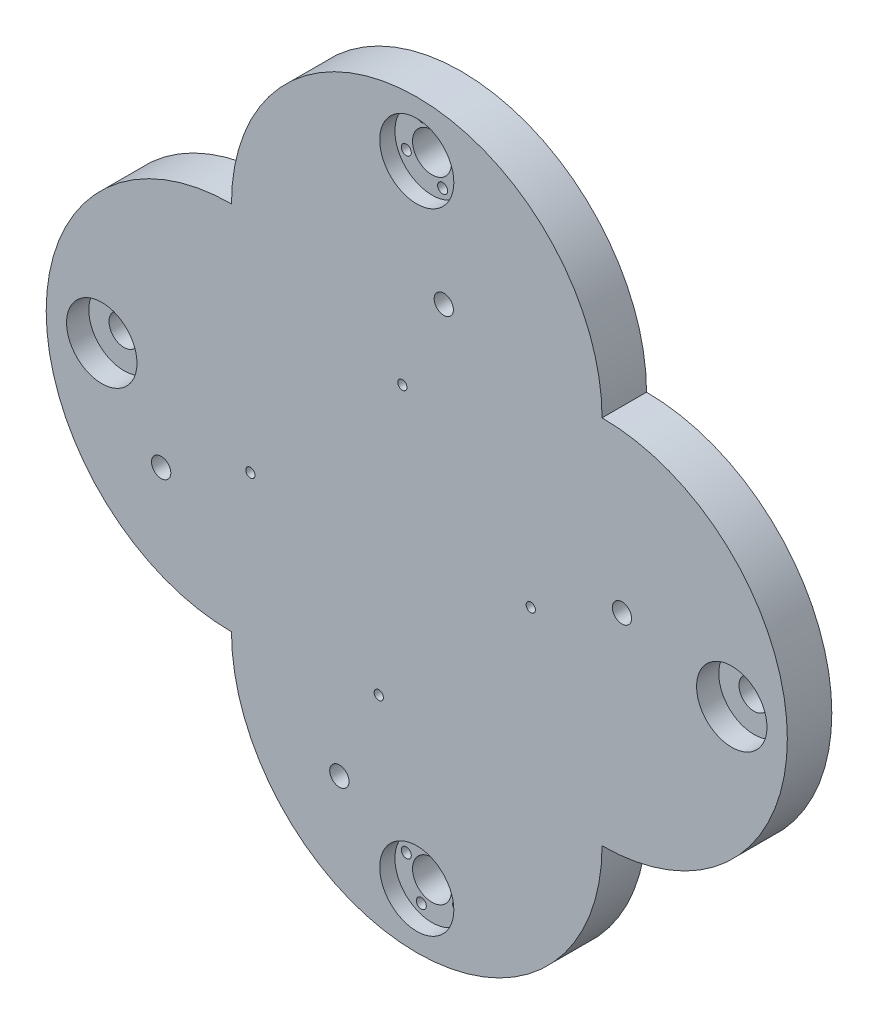
ISO-10303-21;
HEADER;
FILE_DESCRIPTION(('STEP AP214'),'2;1');
FILE_NAME('part.step','',(''),(''),'','','');
FILE_SCHEMA(('AUTOMOTIVE_DESIGN { 1 0 10303 214 1 1 1 1 }'));
ENDSEC;
DATA;
#1=APPLICATION_CONTEXT('core data for automotive mechanical design processes');
#2=APPLICATION_PROTOCOL_DEFINITION('international standard','automotive_design',2000,#1);
#3=PRODUCT_CONTEXT('',#1,'mechanical');
#4=PRODUCT('Part','Part','',(#3));
#5=PRODUCT_RELATED_PRODUCT_CATEGORY('part','',(#4));
#6=PRODUCT_DEFINITION_FORMATION('','',#4);
#7=PRODUCT_DEFINITION_CONTEXT('part definition',#1,'design');
#8=PRODUCT_DEFINITION('design','',#6,#7);
#9=PRODUCT_DEFINITION_SHAPE('','',#8);
#10=(LENGTH_UNIT() NAMED_UNIT(*) SI_UNIT(.MILLI.,.METRE.));
#11=(NAMED_UNIT(*) PLANE_ANGLE_UNIT() SI_UNIT($,.RADIAN.));
#12=(NAMED_UNIT(*) SI_UNIT($,.STERADIAN.) SOLID_ANGLE_UNIT());
#13=UNCERTAINTY_MEASURE_WITH_UNIT(LENGTH_MEASURE(1.E-05),#10,'distance_accuracy_value','');
#14=(GEOMETRIC_REPRESENTATION_CONTEXT(3) GLOBAL_UNCERTAINTY_ASSIGNED_CONTEXT((#13)) GLOBAL_UNIT_ASSIGNED_CONTEXT((#10,
#11,#12)) REPRESENTATION_CONTEXT('',''));
#15=CARTESIAN_POINT('',(0.,0.,0.));
#16=DIRECTION('',(0.,0.,1.));
#17=DIRECTION('',(1.,0.,0.));
#18=AXIS2_PLACEMENT_3D('',#15,#16,#17);
#19=CARTESIAN_POINT('',(60.9927797833935,9.56678700361011,-38.));
#20=DIRECTION('',(0.,0.,1.));
#21=DIRECTION('',(1.,0.,0.));
#22=AXIS2_PLACEMENT_3D('',#19,#20,#21);
#23=CYLINDRICAL_SURFACE('',#22,9.5);
#24=CARTESIAN_POINT('',(60.9927797833935,9.56678700361011,12.));
#25=DIRECTION('',(0.,0.,1.));
#26=DIRECTION('',(1.,0.,0.));
#27=AXIS2_PLACEMENT_3D('',#24,#25,#26);
#28=CIRCLE('',#27,9.5);
#29=CARTESIAN_POINT('',(70.4927797833935,9.56678700361011,12.));
#30=VERTEX_POINT('',#29);
#31=EDGE_CURVE('E298',#30,#30,#28,.T.);
#32=ORIENTED_EDGE('',*,*,#31,.T.);
#33=EDGE_LOOP('',(#32));
#34=FACE_BOUND('',#33,.T.);
#35=CARTESIAN_POINT('',(60.9927797833935,9.56678700361011,6.));
#36=DIRECTION('',(0.,0.,-1.));
#37=DIRECTION('',(-1.,0.,0.));
#38=AXIS2_PLACEMENT_3D('',#35,#36,#37);
#39=CIRCLE('',#38,9.5);
#40=CARTESIAN_POINT('',(51.4927797833935,9.56678700361011,6.));
#41=VERTEX_POINT('',#40);
#42=EDGE_CURVE('E11',#41,#41,#39,.F.);
#43=ORIENTED_EDGE('',*,*,#42,.F.);
#44=EDGE_LOOP('',(#43));
#45=FACE_BOUND('',#44,.T.);
#46=ADVANCED_FACE('F39',(#34,#45),#23,.F.);
#47=CARTESIAN_POINT('',(-109.007220216607,9.56678700361013,-38.));
#48=DIRECTION('',(0.,0.,1.));
#49=DIRECTION('',(1.,0.,0.));
#50=AXIS2_PLACEMENT_3D('',#47,#48,#49);
#51=CYLINDRICAL_SURFACE('',#50,9.5);
#52=CARTESIAN_POINT('',(-109.007220216607,9.56678700361013,12.));
#53=DIRECTION('',(0.,0.,1.));
#54=DIRECTION('',(1.,0.,0.));
#55=AXIS2_PLACEMENT_3D('',#52,#53,#54);
#56=CIRCLE('',#55,9.5);
#57=CARTESIAN_POINT('',(-99.5072202166065,9.56678700361013,12.));
#58=VERTEX_POINT('',#57);
#59=EDGE_CURVE('E300',#58,#58,#56,.T.);
#60=ORIENTED_EDGE('',*,*,#59,.T.);
#61=EDGE_LOOP('',(#60));
#62=FACE_BOUND('',#61,.T.);
#63=CARTESIAN_POINT('',(-109.007220216607,9.56678700361013,6.));
#64=DIRECTION('',(0.,0.,-1.));
#65=DIRECTION('',(-1.,0.,0.));
#66=AXIS2_PLACEMENT_3D('',#63,#64,#65);
#67=CIRCLE('',#66,9.5);
#68=CARTESIAN_POINT('',(-118.507220216607,9.56678700361013,6.));
#69=VERTEX_POINT('',#68);
#70=EDGE_CURVE('E48',#69,#69,#67,.F.);
#71=ORIENTED_EDGE('',*,*,#70,.F.);
#72=EDGE_LOOP('',(#71));
#73=FACE_BOUND('',#72,.T.);
#74=ADVANCED_FACE('F134',(#62,#73),#51,.F.);
#75=CARTESIAN_POINT('',(0.,0.,0.));
#76=DIRECTION('',(0.,0.,1.));
#77=DIRECTION('',(1.,0.,0.));
#78=AXIS2_PLACEMENT_3D('',#75,#76,#77);
#79=PLANE('',#78);
#80=CARTESIAN_POINT('',(-16.7171078360063,64.7627365231504,0.));
#81=DIRECTION('',(0.,0.,1.));
#82=DIRECTION('',(1.,0.,0.));
#83=AXIS2_PLACEMENT_3D('',#80,#81,#82);
#84=CIRCLE('',#83,2.59999999999999);
#85=CARTESIAN_POINT('',(-14.1171078360064,64.7627365231504,0.));
#86=VERTEX_POINT('',#85);
#87=EDGE_CURVE('E287',#86,#86,#84,.T.);
#88=ORIENTED_EDGE('',*,*,#87,.T.);
#89=EDGE_LOOP('',(#88));
#90=FACE_BOUND('',#89,.T.);
#91=CARTESIAN_POINT('',(31.3661532846789,16.6794754024652,0.));
#92=DIRECTION('',(0.,0.,1.));
#93=DIRECTION('',(1.,0.,0.));
#94=AXIS2_PLACEMENT_3D('',#91,#92,#93);
#95=CIRCLE('',#94,2.6);
#96=CARTESIAN_POINT('',(33.9661532846789,16.6794754024652,0.));
#97=VERTEX_POINT('',#96);
#98=EDGE_CURVE('E292',#97,#97,#95,.T.);
#99=ORIENTED_EDGE('',*,*,#98,.T.);
#100=EDGE_LOOP('',(#99));
#101=FACE_BOUND('',#100,.T.);
#102=CARTESIAN_POINT('',(-92.980015992399,-11.5001716332424,0.));
#103=DIRECTION('',(0.,0.,1.));
#104=DIRECTION('',(1.,0.,0.));
#105=AXIS2_PLACEMENT_3D('',#102,#103,#104);
#106=CIRCLE('',#105,2.6);
#107=CARTESIAN_POINT('',(-90.3800159923991,-11.5001716332424,0.));
#108=VERTEX_POINT('',#107);
#109=EDGE_CURVE('E475',#108,#108,#106,.T.);
#110=ORIENTED_EDGE('',*,*,#109,.T.);
#111=EDGE_LOOP('',(#110));
#112=FACE_BOUND('',#111,.T.);
#113=CARTESIAN_POINT('',(-44.8967548717138,-59.5834327539276,0.));
#114=DIRECTION('',(0.,0.,1.));
#115=DIRECTION('',(1.,0.,0.));
#116=AXIS2_PLACEMENT_3D('',#113,#114,#115);
#117=CIRCLE('',#116,2.6);
#118=CARTESIAN_POINT('',(-42.2967548717138,-59.5834327539276,0.));
#119=VERTEX_POINT('',#118);
#120=EDGE_CURVE('E478',#119,#119,#117,.T.);
#121=ORIENTED_EDGE('',*,*,#120,.T.);
#122=EDGE_LOOP('',(#121));
#123=FACE_BOUND('',#122,.T.);
#124=CARTESIAN_POINT('',(-26.8800877770809,-82.3611731564928,0.));
#125=DIRECTION('',(0.,0.,1.));
#126=DIRECTION('',(1.,0.,0.));
#127=AXIS2_PLACEMENT_3D('',#124,#125,#126);
#128=CIRCLE('',#127,1.35);
#129=CARTESIAN_POINT('',(-25.5300877770809,-82.3611731564928,0.));
#130=VERTEX_POINT('',#129);
#131=EDGE_CURVE('E338',#130,#130,#128,.F.);
#132=ORIENTED_EDGE('',*,*,#131,.F.);
#133=EDGE_LOOP('',(#132));
#134=FACE_BOUND('',#133,.T.);
#135=CARTESIAN_POINT('',(-21.1343526561322,87.6388268435071,0.));
#136=DIRECTION('',(0.,0.,1.));
#137=DIRECTION('',(1.,0.,0.));
#138=AXIS2_PLACEMENT_3D('',#135,#136,#137);
#139=CIRCLE('',#138,1.35000000000001);
#140=CARTESIAN_POINT('',(-19.7843526561322,87.6388268435071,0.));
#141=VERTEX_POINT('',#140);
#142=EDGE_CURVE('E346',#141,#141,#139,.T.);
#143=ORIENTED_EDGE('',*,*,#142,.T.);
#144=EDGE_LOOP('',(#143));
#145=FACE_BOUND('',#144,.T.);
#146=CARTESIAN_POINT('',(-24.0072202166065,94.5667870036101,0.));
#147=DIRECTION('',(0.,0.,1.));
#148=DIRECTION('',(1.,0.,0.));
#149=AXIS2_PLACEMENT_3D('',#146,#147,#148);
#150=CIRCLE('',#149,5.25);
#151=CARTESIAN_POINT('',(-18.7572202166065,94.5667870036101,0.));
#152=VERTEX_POINT('',#151);
#153=EDGE_CURVE('E342',#152,#152,#150,.T.);
#154=ORIENTED_EDGE('',*,*,#153,.T.);
#155=EDGE_LOOP('',(#154));
#156=FACE_BOUND('',#155,.T.);
#157=CARTESIAN_POINT('',(-24.0072202166065,-40.4332129963899,0.));
#158=DIRECTION('',(0.,0.,1.));
#159=DIRECTION('',(1.,0.,0.));
#160=AXIS2_PLACEMENT_3D('',#157,#158,#159);
#161=CIRCLE('',#160,50.);
#162=CARTESIAN_POINT('',(-74.0072202166065,-40.4332129963899,0.));
#163=VERTEX_POINT('',#162);
#164=CARTESIAN_POINT('',(25.9927797833935,-40.4332129963899,0.));
#165=VERTEX_POINT('',#164);
#166=EDGE_CURVE('E108',#163,#165,#161,.T.);
#167=ORIENTED_EDGE('',*,*,#166,.F.);
#168=CARTESIAN_POINT('',(-74.0072202166065,9.56678700361013,0.));
#169=DIRECTION('',(0.,0.,1.));
#170=DIRECTION('',(1.,0.,0.));
#171=AXIS2_PLACEMENT_3D('',#168,#169,#170);
#172=CIRCLE('',#171,50.);
#173=CARTESIAN_POINT('',(-74.0072202166065,59.5667870036101,0.));
#174=VERTEX_POINT('',#173);
#175=EDGE_CURVE('E79',#174,#163,#172,.T.);
#176=ORIENTED_EDGE('',*,*,#175,.F.);
#177=CARTESIAN_POINT('',(-24.0072202166065,59.5667870036101,0.));
#178=DIRECTION('',(0.,0.,1.));
#179=DIRECTION('',(1.,0.,0.));
#180=AXIS2_PLACEMENT_3D('',#177,#178,#179);
#181=CIRCLE('',#180,50.);
#182=CARTESIAN_POINT('',(25.9927797833935,59.5667870036101,0.));
#183=VERTEX_POINT('',#182);
#184=EDGE_CURVE('E73',#183,#174,#181,.T.);
#185=ORIENTED_EDGE('',*,*,#184,.F.);
#186=CARTESIAN_POINT('',(25.9927797833935,9.56678700361012,0.));
#187=DIRECTION('',(0.,0.,1.));
#188=DIRECTION('',(1.,0.,0.));
#189=AXIS2_PLACEMENT_3D('',#186,#187,#188);
#190=CIRCLE('',#189,50.);
#191=EDGE_CURVE('E98',#165,#183,#190,.T.);
#192=ORIENTED_EDGE('',*,*,#191,.F.);
#193=EDGE_LOOP('',(#167,#176,#185,#192));
#194=FACE_BOUND('',#193,.T.);
#195=CARTESIAN_POINT('',(6.75323093141419,5.6776997070942,0.));
#196=DIRECTION('',(0.,0.,1.));
#197=DIRECTION('',(1.,0.,0.));
#198=AXIS2_PLACEMENT_3D('',#195,#196,#197);
#199=CIRCLE('',#198,1.24999999998652);
#200=CARTESIAN_POINT('',(8.0032309314007,5.6776997070942,0.));
#201=VERTEX_POINT('',#200);
#202=EDGE_CURVE('E118',#201,#201,#199,.T.);
#203=ORIENTED_EDGE('',*,*,#202,.T.);
#204=EDGE_LOOP('',(#203));
#205=FACE_BOUND('',#204,.T.);
#206=CARTESIAN_POINT('',(-34.2589623774055,-35.3344936017257,0.));
#207=DIRECTION('',(0.,0.,1.));
#208=DIRECTION('',(1.,0.,0.));
#209=AXIS2_PLACEMENT_3D('',#206,#207,#208);
#210=CIRCLE('',#209,1.24999999998655);
#211=CARTESIAN_POINT('',(-33.008962377419,-35.3344936017257,0.));
#212=VERTEX_POINT('',#211);
#213=EDGE_CURVE('E121',#212,#212,#210,.T.);
#214=ORIENTED_EDGE('',*,*,#213,.T.);
#215=EDGE_LOOP('',(#214));
#216=FACE_BOUND('',#215,.T.);
#217=CARTESIAN_POINT('',(-68.9071946555365,-0.686261323594839,0.));
#218=DIRECTION('',(0.,0.,1.));
#219=DIRECTION('',(1.,0.,0.));
#220=AXIS2_PLACEMENT_3D('',#217,#218,#219);
#221=CIRCLE('',#220,1.2499999999866);
#222=CARTESIAN_POINT('',(-67.6571946555499,-0.686261323594839,0.));
#223=VERTEX_POINT('',#222);
#224=EDGE_CURVE('E125',#223,#223,#221,.T.);
#225=ORIENTED_EDGE('',*,*,#224,.T.);
#226=EDGE_LOOP('',(#225));
#227=FACE_BOUND('',#226,.T.);
#228=CARTESIAN_POINT('',(-27.8950013467167,40.325931985225,0.));
#229=DIRECTION('',(0.,0.,1.));
#230=DIRECTION('',(1.,0.,0.));
#231=AXIS2_PLACEMENT_3D('',#228,#229,#230);
#232=CIRCLE('',#231,1.24999999998654);
#233=CARTESIAN_POINT('',(-26.6450013467302,40.325931985225,0.));
#234=VERTEX_POINT('',#233);
#235=EDGE_CURVE('E111',#234,#234,#232,.T.);
#236=ORIENTED_EDGE('',*,*,#235,.T.);
#237=EDGE_LOOP('',(#236));
#238=FACE_BOUND('',#237,.T.);
#239=CARTESIAN_POINT('',(-24.0072202166066,-75.4332129963898,0.));
#240=DIRECTION('',(0.,0.,1.));
#241=DIRECTION('',(1.,0.,0.));
#242=AXIS2_PLACEMENT_3D('',#239,#240,#241);
#243=CIRCLE('',#242,5.25000000000001);
#244=CARTESIAN_POINT('',(-18.7572202166066,-75.4332129963898,0.));
#245=VERTEX_POINT('',#244);
#246=EDGE_CURVE('E253',#245,#245,#243,.F.);
#247=ORIENTED_EDGE('',*,*,#246,.F.);
#248=EDGE_LOOP('',(#247));
#249=FACE_BOUND('',#248,.T.);
#250=CARTESIAN_POINT('',(-21.1343526561322,-68.5052528362869,0.));
#251=DIRECTION('',(0.,0.,1.));
#252=DIRECTION('',(1.,0.,0.));
#253=AXIS2_PLACEMENT_3D('',#250,#251,#252);
#254=CIRCLE('',#253,1.35000000000001);
#255=CARTESIAN_POINT('',(-19.7843526561322,-68.5052528362869,0.));
#256=VERTEX_POINT('',#255);
#257=EDGE_CURVE('E257',#256,#256,#254,.F.);
#258=ORIENTED_EDGE('',*,*,#257,.F.);
#259=EDGE_LOOP('',(#258));
#260=FACE_BOUND('',#259,.T.);
#261=CARTESIAN_POINT('',(-30.9351803767096,-72.5603454359156,0.));
#262=DIRECTION('',(0.,0.,1.));
#263=DIRECTION('',(1.,0.,0.));
#264=AXIS2_PLACEMENT_3D('',#261,#262,#263);
#265=CIRCLE('',#264,1.35);
#266=CARTESIAN_POINT('',(-29.5851803767096,-72.5603454359156,0.));
#267=VERTEX_POINT('',#266);
#268=EDGE_CURVE('E261',#267,#267,#265,.F.);
#269=ORIENTED_EDGE('',*,*,#268,.F.);
#270=EDGE_LOOP('',(#269));
#271=FACE_BOUND('',#270,.T.);
#272=CARTESIAN_POINT('',(-17.0792600565036,-78.3060805568642,0.));
#273=DIRECTION('',(0.,0.,1.));
#274=DIRECTION('',(1.,0.,0.));
#275=AXIS2_PLACEMENT_3D('',#272,#273,#274);
#276=CIRCLE('',#275,1.35);
#277=CARTESIAN_POINT('',(-15.7292600565036,-78.3060805568642,0.));
#278=VERTEX_POINT('',#277);
#279=EDGE_CURVE('E265',#278,#278,#276,.F.);
#280=ORIENTED_EDGE('',*,*,#279,.F.);
#281=EDGE_LOOP('',(#280));
#282=FACE_BOUND('',#281,.T.);
#283=CARTESIAN_POINT('',(-26.8800877770809,101.494747163713,0.));
#284=DIRECTION('',(0.,0.,1.));
#285=DIRECTION('',(1.,0.,0.));
#286=AXIS2_PLACEMENT_3D('',#283,#284,#285);
#287=CIRCLE('',#286,1.35);
#288=CARTESIAN_POINT('',(-25.5300877770809,101.494747163713,0.));
#289=VERTEX_POINT('',#288);
#290=EDGE_CURVE('E269',#289,#289,#287,.T.);
#291=ORIENTED_EDGE('',*,*,#290,.T.);
#292=EDGE_LOOP('',(#291));
#293=FACE_BOUND('',#292,.T.);
#294=CARTESIAN_POINT('',(-30.9351803767095,91.6939194431358,0.));
#295=DIRECTION('',(0.,0.,1.));
#296=DIRECTION('',(1.,0.,0.));
#297=AXIS2_PLACEMENT_3D('',#294,#295,#296);
#298=CIRCLE('',#297,1.35);
#299=CARTESIAN_POINT('',(-29.5851803767095,91.6939194431358,0.));
#300=VERTEX_POINT('',#299);
#301=EDGE_CURVE('E273',#300,#300,#298,.T.);
#302=ORIENTED_EDGE('',*,*,#301,.T.);
#303=EDGE_LOOP('',(#302));
#304=FACE_BOUND('',#303,.T.);
#305=CARTESIAN_POINT('',(-17.0792600565035,97.4396545640844,0.));
#306=DIRECTION('',(0.,0.,1.));
#307=DIRECTION('',(1.,0.,0.));
#308=AXIS2_PLACEMENT_3D('',#305,#306,#307);
#309=CIRCLE('',#308,1.35);
#310=CARTESIAN_POINT('',(-15.7292600565035,97.4396545640844,0.));
#311=VERTEX_POINT('',#310);
#312=EDGE_CURVE('E277',#311,#311,#309,.T.);
#313=ORIENTED_EDGE('',*,*,#312,.T.);
#314=EDGE_LOOP('',(#313));
#315=FACE_BOUND('',#314,.T.);
#316=CARTESIAN_POINT('',(-109.007220216607,9.56678700361013,0.));
#317=DIRECTION('',(0.,0.,-1.));
#318=DIRECTION('',(-1.,0.,0.));
#319=AXIS2_PLACEMENT_3D('',#316,#317,#318);
#320=CIRCLE('',#319,4.05);
#321=CARTESIAN_POINT('',(-113.057220216607,9.56678700361013,0.));
#322=VERTEX_POINT('',#321);
#323=EDGE_CURVE('E281',#322,#322,#320,.T.);
#324=ORIENTED_EDGE('',*,*,#323,.F.);
#325=EDGE_LOOP('',(#324));
#326=FACE_BOUND('',#325,.T.);
#327=CARTESIAN_POINT('',(60.9927797833935,9.56678700361011,0.));
#328=DIRECTION('',(0.,0.,-1.));
#329=DIRECTION('',(-1.,0.,0.));
#330=AXIS2_PLACEMENT_3D('',#327,#328,#329);
#331=CIRCLE('',#330,4.05);
#332=CARTESIAN_POINT('',(56.9427797833935,9.56678700361011,0.));
#333=VERTEX_POINT('',#332);
#334=EDGE_CURVE('E284',#333,#333,#331,.T.);
#335=ORIENTED_EDGE('',*,*,#334,.F.);
#336=EDGE_LOOP('',(#335));
#337=FACE_BOUND('',#336,.T.);
#338=ADVANCED_FACE('F136',(#90,#101,#112,#123,#134,#145,#156,#194,#205,#216,#227,#238,#249,#260,
#271,#282,#293,#304,#315,#326,#337),#79,.F.);
#339=CARTESIAN_POINT('',(0.,0.,12.));
#340=DIRECTION('',(0.,0.,1.));
#341=DIRECTION('',(1.,0.,0.));
#342=AXIS2_PLACEMENT_3D('',#339,#340,#341);
#343=PLANE('',#342);
#344=CARTESIAN_POINT('',(-16.7171078360063,64.7627365231504,12.));
#345=DIRECTION('',(0.,0.,1.));
#346=DIRECTION('',(1.,0.,0.));
#347=AXIS2_PLACEMENT_3D('',#344,#345,#346);
#348=CIRCLE('',#347,2.59999999999999);
#349=CARTESIAN_POINT('',(-14.1171078360064,64.7627365231504,12.));
#350=VERTEX_POINT('',#349);
#351=EDGE_CURVE('E466',#350,#350,#348,.T.);
#352=ORIENTED_EDGE('',*,*,#351,.F.);
#353=EDGE_LOOP('',(#352));
#354=FACE_BOUND('',#353,.T.);
#355=CARTESIAN_POINT('',(31.3661532846789,16.6794754024652,12.));
#356=DIRECTION('',(0.,0.,1.));
#357=DIRECTION('',(1.,0.,0.));
#358=AXIS2_PLACEMENT_3D('',#355,#356,#357);
#359=CIRCLE('',#358,2.6);
#360=CARTESIAN_POINT('',(33.9661532846789,16.6794754024652,12.));
#361=VERTEX_POINT('',#360);
#362=EDGE_CURVE('E482',#361,#361,#359,.T.);
#363=ORIENTED_EDGE('',*,*,#362,.F.);
#364=EDGE_LOOP('',(#363));
#365=FACE_BOUND('',#364,.T.);
#366=CARTESIAN_POINT('',(-92.980015992399,-11.5001716332424,12.));
#367=DIRECTION('',(0.,0.,1.));
#368=DIRECTION('',(1.,0.,0.));
#369=AXIS2_PLACEMENT_3D('',#366,#367,#368);
#370=CIRCLE('',#369,2.6);
#371=CARTESIAN_POINT('',(-90.3800159923991,-11.5001716332424,12.));
#372=VERTEX_POINT('',#371);
#373=EDGE_CURVE('E489',#372,#372,#370,.T.);
#374=ORIENTED_EDGE('',*,*,#373,.F.);
#375=EDGE_LOOP('',(#374));
#376=FACE_BOUND('',#375,.T.);
#377=CARTESIAN_POINT('',(-44.8967548717138,-59.5834327539276,12.));
#378=DIRECTION('',(0.,0.,1.));
#379=DIRECTION('',(1.,0.,0.));
#380=AXIS2_PLACEMENT_3D('',#377,#378,#379);
#381=CIRCLE('',#380,2.6);
#382=CARTESIAN_POINT('',(-42.2967548717138,-59.5834327539276,12.));
#383=VERTEX_POINT('',#382);
#384=EDGE_CURVE('E485',#383,#383,#381,.T.);
#385=ORIENTED_EDGE('',*,*,#384,.F.);
#386=EDGE_LOOP('',(#385));
#387=FACE_BOUND('',#386,.T.);
#388=ORIENTED_EDGE('',*,*,#59,.F.);
#389=EDGE_LOOP('',(#388));
#390=FACE_BOUND('',#389,.T.);
#391=ORIENTED_EDGE('',*,*,#31,.F.);
#392=EDGE_LOOP('',(#391));
#393=FACE_BOUND('',#392,.T.);
#394=CARTESIAN_POINT('',(-24.0072202166065,-40.4332129963899,12.));
#395=DIRECTION('',(0.,0.,1.));
#396=DIRECTION('',(1.,0.,0.));
#397=AXIS2_PLACEMENT_3D('',#394,#395,#396);
#398=CIRCLE('',#397,50.);
#399=CARTESIAN_POINT('',(-74.0072202166065,-40.4332129963899,12.));
#400=VERTEX_POINT('',#399);
#401=CARTESIAN_POINT('',(25.9927797833935,-40.4332129963899,12.));
#402=VERTEX_POINT('',#401);
#403=EDGE_CURVE('E93',#400,#402,#398,.T.);
#404=ORIENTED_EDGE('',*,*,#403,.T.);
#405=CARTESIAN_POINT('',(25.9927797833935,9.56678700361012,12.));
#406=DIRECTION('',(0.,0.,1.));
#407=DIRECTION('',(1.,0.,0.));
#408=AXIS2_PLACEMENT_3D('',#405,#406,#407);
#409=CIRCLE('',#408,50.);
#410=CARTESIAN_POINT('',(25.9927797833935,59.5667870036101,12.));
#411=VERTEX_POINT('',#410);
#412=EDGE_CURVE('E87',#402,#411,#409,.T.);
#413=ORIENTED_EDGE('',*,*,#412,.T.);
#414=CARTESIAN_POINT('',(-24.0072202166065,59.5667870036101,12.));
#415=DIRECTION('',(0.,0.,1.));
#416=DIRECTION('',(1.,0.,0.));
#417=AXIS2_PLACEMENT_3D('',#414,#415,#416);
#418=CIRCLE('',#417,50.);
#419=CARTESIAN_POINT('',(-74.0072202166065,59.5667870036101,12.));
#420=VERTEX_POINT('',#419);
#421=EDGE_CURVE('E91',#411,#420,#418,.T.);
#422=ORIENTED_EDGE('',*,*,#421,.T.);
#423=CARTESIAN_POINT('',(-74.0072202166065,9.56678700361013,12.));
#424=DIRECTION('',(0.,0.,1.));
#425=DIRECTION('',(1.,0.,0.));
#426=AXIS2_PLACEMENT_3D('',#423,#424,#425);
#427=CIRCLE('',#426,50.);
#428=EDGE_CURVE('E56',#420,#400,#427,.T.);
#429=ORIENTED_EDGE('',*,*,#428,.T.);
#430=EDGE_LOOP('',(#404,#413,#422,#429));
#431=FACE_BOUND('',#430,.T.);
#432=CARTESIAN_POINT('',(6.75323093141419,5.6776997070942,12.));
#433=DIRECTION('',(0.,0.,1.));
#434=DIRECTION('',(1.,0.,0.));
#435=AXIS2_PLACEMENT_3D('',#432,#433,#434);
#436=CIRCLE('',#435,1.24999999998652);
#437=CARTESIAN_POINT('',(8.0032309314007,5.6776997070942,12.));
#438=VERTEX_POINT('',#437);
#439=EDGE_CURVE('E354',#438,#438,#436,.T.);
#440=ORIENTED_EDGE('',*,*,#439,.F.);
#441=EDGE_LOOP('',(#440));
#442=FACE_BOUND('',#441,.T.);
#443=CARTESIAN_POINT('',(-34.2589623774055,-35.3344936017257,12.));
#444=DIRECTION('',(0.,0.,1.));
#445=DIRECTION('',(1.,0.,0.));
#446=AXIS2_PLACEMENT_3D('',#443,#444,#445);
#447=CIRCLE('',#446,1.24999999998655);
#448=CARTESIAN_POINT('',(-33.008962377419,-35.3344936017257,12.));
#449=VERTEX_POINT('',#448);
#450=EDGE_CURVE('E368',#449,#449,#447,.T.);
#451=ORIENTED_EDGE('',*,*,#450,.F.);
#452=EDGE_LOOP('',(#451));
#453=FACE_BOUND('',#452,.T.);
#454=CARTESIAN_POINT('',(-68.9071946555365,-0.686261323594839,12.));
#455=DIRECTION('',(0.,0.,1.));
#456=DIRECTION('',(1.,0.,0.));
#457=AXIS2_PLACEMENT_3D('',#454,#455,#456);
#458=CIRCLE('',#457,1.2499999999866);
#459=CARTESIAN_POINT('',(-67.6571946555499,-0.686261323594839,12.));
#460=VERTEX_POINT('',#459);
#461=EDGE_CURVE('E365',#460,#460,#458,.T.);
#462=ORIENTED_EDGE('',*,*,#461,.F.);
#463=EDGE_LOOP('',(#462));
#464=FACE_BOUND('',#463,.T.);
#465=CARTESIAN_POINT('',(-27.8950013467167,40.325931985225,12.));
#466=DIRECTION('',(0.,0.,1.));
#467=DIRECTION('',(1.,0.,0.));
#468=AXIS2_PLACEMENT_3D('',#465,#466,#467);
#469=CIRCLE('',#468,1.24999999998654);
#470=CARTESIAN_POINT('',(-26.6450013467302,40.325931985225,12.));
#471=VERTEX_POINT('',#470);
#472=EDGE_CURVE('E122',#471,#471,#469,.T.);
#473=ORIENTED_EDGE('',*,*,#472,.F.);
#474=EDGE_LOOP('',(#473));
#475=FACE_BOUND('',#474,.T.);
#476=CARTESIAN_POINT('',(-24.0072202166065,94.5667870036101,12.));
#477=DIRECTION('',(0.,0.,1.));
#478=DIRECTION('',(1.,0.,0.));
#479=AXIS2_PLACEMENT_3D('',#476,#477,#478);
#480=CIRCLE('',#479,10.);
#481=CARTESIAN_POINT('',(-14.0072202166065,94.5667870036101,12.));
#482=VERTEX_POINT('',#481);
#483=EDGE_CURVE('E358',#482,#482,#480,.T.);
#484=ORIENTED_EDGE('',*,*,#483,.F.);
#485=EDGE_LOOP('',(#484));
#486=FACE_BOUND('',#485,.T.);
#487=CARTESIAN_POINT('',(-24.0072202166066,-75.4332129963898,12.));
#488=DIRECTION('',(0.,0.,1.));
#489=DIRECTION('',(1.,0.,0.));
#490=AXIS2_PLACEMENT_3D('',#487,#488,#489);
#491=CIRCLE('',#490,10.);
#492=CARTESIAN_POINT('',(-14.0072202166066,-75.4332129963898,12.));
#493=VERTEX_POINT('',#492);
#494=EDGE_CURVE('E355',#493,#493,#491,.F.);
#495=ORIENTED_EDGE('',*,*,#494,.T.);
#496=EDGE_LOOP('',(#495));
#497=FACE_BOUND('',#496,.T.);
#498=ADVANCED_FACE('F88',(#354,#365,#376,#387,#390,#393,#431,#442,#453,#464,#475,#486,#497),
#343,.T.);
#499=CARTESIAN_POINT('',(-24.0072202166065,-40.4332129963899,12.));
#500=DIRECTION('',(0.,0.,-1.));
#501=DIRECTION('',(-1.,0.,0.));
#502=AXIS2_PLACEMENT_3D('',#499,#500,#501);
#503=CYLINDRICAL_SURFACE('',#502,50.);
#504=ORIENTED_EDGE('',*,*,#166,.T.);
#505=DIRECTION('',(0.,0.,-1.));
#506=VECTOR('',#505,1.);
#507=CARTESIAN_POINT('',(25.9927797833935,-40.4332129963899,12.));
#508=LINE('',#507,#506);
#509=EDGE_CURVE('E99',#402,#165,#508,.T.);
#510=ORIENTED_EDGE('',*,*,#509,.F.);
#511=ORIENTED_EDGE('',*,*,#403,.F.);
#512=DIRECTION('',(0.,0.,-1.));
#513=VECTOR('',#512,1.);
#514=CARTESIAN_POINT('',(-74.0072202166065,-40.4332129963899,12.));
#515=LINE('',#514,#513);
#516=EDGE_CURVE('E104',#400,#163,#515,.T.);
#517=ORIENTED_EDGE('',*,*,#516,.T.);
#518=EDGE_LOOP('',(#504,#510,#511,#517));
#519=FACE_BOUND('',#518,.T.);
#520=ADVANCED_FACE('F41',(#519),#503,.T.);
#521=CARTESIAN_POINT('',(25.9927797833935,9.56678700361012,12.));
#522=DIRECTION('',(0.,0.,-1.));
#523=DIRECTION('',(-1.,0.,0.));
#524=AXIS2_PLACEMENT_3D('',#521,#522,#523);
#525=CYLINDRICAL_SURFACE('',#524,50.);
#526=ORIENTED_EDGE('',*,*,#191,.T.);
#527=DIRECTION('',(0.,0.,-1.));
#528=VECTOR('',#527,1.);
#529=CARTESIAN_POINT('',(25.9927797833935,59.5667870036101,12.));
#530=LINE('',#529,#528);
#531=EDGE_CURVE('E96',#411,#183,#530,.T.);
#532=ORIENTED_EDGE('',*,*,#531,.F.);
#533=ORIENTED_EDGE('',*,*,#412,.F.);
#534=ORIENTED_EDGE('',*,*,#509,.T.);
#535=EDGE_LOOP('',(#526,#532,#533,#534));
#536=FACE_BOUND('',#535,.T.);
#537=ADVANCED_FACE('F97',(#536),#525,.T.);
#538=CARTESIAN_POINT('',(-24.0072202166065,59.5667870036101,12.));
#539=DIRECTION('',(0.,0.,-1.));
#540=DIRECTION('',(-1.,0.,0.));
#541=AXIS2_PLACEMENT_3D('',#538,#539,#540);
#542=CYLINDRICAL_SURFACE('',#541,50.);
#543=ORIENTED_EDGE('',*,*,#184,.T.);
#544=DIRECTION('',(0.,0.,-1.));
#545=VECTOR('',#544,1.);
#546=CARTESIAN_POINT('',(-74.0072202166065,59.5667870036101,12.));
#547=LINE('',#546,#545);
#548=EDGE_CURVE('E100',#420,#174,#547,.T.);
#549=ORIENTED_EDGE('',*,*,#548,.F.);
#550=ORIENTED_EDGE('',*,*,#421,.F.);
#551=ORIENTED_EDGE('',*,*,#531,.T.);
#552=EDGE_LOOP('',(#543,#549,#550,#551));
#553=FACE_BOUND('',#552,.T.);
#554=ADVANCED_FACE('F102',(#553),#542,.T.);
#555=CARTESIAN_POINT('',(-74.0072202166065,9.56678700361013,12.));
#556=DIRECTION('',(0.,0.,-1.));
#557=DIRECTION('',(-1.,0.,0.));
#558=AXIS2_PLACEMENT_3D('',#555,#556,#557);
#559=CYLINDRICAL_SURFACE('',#558,50.);
#560=ORIENTED_EDGE('',*,*,#175,.T.);
#561=ORIENTED_EDGE('',*,*,#516,.F.);
#562=ORIENTED_EDGE('',*,*,#428,.F.);
#563=ORIENTED_EDGE('',*,*,#548,.T.);
#564=EDGE_LOOP('',(#560,#561,#562,#563));
#565=FACE_BOUND('',#564,.T.);
#566=ADVANCED_FACE('F223',(#565),#559,.T.);
#567=CARTESIAN_POINT('',(6.75323093141419,5.6776997070942,-38.));
#568=DIRECTION('',(0.,0.,1.));
#569=DIRECTION('',(1.,0.,0.));
#570=AXIS2_PLACEMENT_3D('',#567,#568,#569);
#571=CYLINDRICAL_SURFACE('',#570,1.24999999998652);
#572=ORIENTED_EDGE('',*,*,#439,.T.);
#573=EDGE_LOOP('',(#572));
#574=FACE_BOUND('',#573,.T.);
#575=ORIENTED_EDGE('',*,*,#202,.F.);
#576=EDGE_LOOP('',(#575));
#577=FACE_BOUND('',#576,.T.);
#578=ADVANCED_FACE('F219',(#574,#577),#571,.F.);
#579=CARTESIAN_POINT('',(-34.2589623774055,-35.3344936017257,-38.));
#580=DIRECTION('',(0.,0.,1.));
#581=DIRECTION('',(1.,0.,0.));
#582=AXIS2_PLACEMENT_3D('',#579,#580,#581);
#583=CYLINDRICAL_SURFACE('',#582,1.24999999998655);
#584=ORIENTED_EDGE('',*,*,#450,.T.);
#585=EDGE_LOOP('',(#584));
#586=FACE_BOUND('',#585,.T.);
#587=ORIENTED_EDGE('',*,*,#213,.F.);
#588=EDGE_LOOP('',(#587));
#589=FACE_BOUND('',#588,.T.);
#590=ADVANCED_FACE('F215',(#586,#589),#583,.F.);
#591=CARTESIAN_POINT('',(-68.9071946555365,-0.686261323594839,-38.));
#592=DIRECTION('',(0.,0.,1.));
#593=DIRECTION('',(1.,0.,0.));
#594=AXIS2_PLACEMENT_3D('',#591,#592,#593);
#595=CYLINDRICAL_SURFACE('',#594,1.2499999999866);
#596=ORIENTED_EDGE('',*,*,#461,.T.);
#597=EDGE_LOOP('',(#596));
#598=FACE_BOUND('',#597,.T.);
#599=ORIENTED_EDGE('',*,*,#224,.F.);
#600=EDGE_LOOP('',(#599));
#601=FACE_BOUND('',#600,.T.);
#602=ADVANCED_FACE('F211',(#598,#601),#595,.F.);
#603=CARTESIAN_POINT('',(-27.8950013467167,40.325931985225,-38.));
#604=DIRECTION('',(0.,0.,1.));
#605=DIRECTION('',(1.,0.,0.));
#606=AXIS2_PLACEMENT_3D('',#603,#604,#605);
#607=CYLINDRICAL_SURFACE('',#606,1.24999999998654);
#608=ORIENTED_EDGE('',*,*,#472,.T.);
#609=EDGE_LOOP('',(#608));
#610=FACE_BOUND('',#609,.T.);
#611=ORIENTED_EDGE('',*,*,#235,.F.);
#612=EDGE_LOOP('',(#611));
#613=FACE_BOUND('',#612,.T.);
#614=ADVANCED_FACE('F204',(#610,#613),#607,.F.);
#615=CARTESIAN_POINT('',(-24.0072202166065,94.5667870036101,7.9));
#616=DIRECTION('',(0.,0.,1.));
#617=DIRECTION('',(1.,0.,0.));
#618=AXIS2_PLACEMENT_3D('',#615,#616,#617);
#619=CYLINDRICAL_SURFACE('',#618,10.);
#620=CARTESIAN_POINT('',(-24.0072202166065,94.5667870036101,7.9));
#621=DIRECTION('',(0.,0.,1.));
#622=DIRECTION('',(1.,0.,0.));
#623=AXIS2_PLACEMENT_3D('',#620,#621,#622);
#624=CIRCLE('',#623,10.);
#625=CARTESIAN_POINT('',(-14.0072202166065,94.5667870036101,7.9));
#626=VERTEX_POINT('',#625);
#627=EDGE_CURVE('E350',#626,#626,#624,.T.);
#628=ORIENTED_EDGE('',*,*,#627,.F.);
#629=EDGE_LOOP('',(#628));
#630=FACE_BOUND('',#629,.T.);
#631=ORIENTED_EDGE('',*,*,#483,.T.);
#632=EDGE_LOOP('',(#631));
#633=FACE_BOUND('',#632,.T.);
#634=ADVANCED_FACE('F201',(#630,#633),#619,.F.);
#635=CARTESIAN_POINT('',(-24.0072202166065,94.5667870036101,7.9));
#636=DIRECTION('',(0.,0.,1.));
#637=DIRECTION('',(1.,0.,0.));
#638=AXIS2_PLACEMENT_3D('',#635,#636,#637);
#639=PLANE('',#638);
#640=CARTESIAN_POINT('',(-17.0792600565035,97.4396545640844,7.9));
#641=DIRECTION('',(0.,0.,1.));
#642=DIRECTION('',(1.,0.,0.));
#643=AXIS2_PLACEMENT_3D('',#640,#641,#642);
#644=CIRCLE('',#643,1.35);
#645=CARTESIAN_POINT('',(-15.7292600565035,97.4396545640844,7.9));
#646=VERTEX_POINT('',#645);
#647=EDGE_CURVE('E302',#646,#646,#644,.T.);
#648=ORIENTED_EDGE('',*,*,#647,.F.);
#649=EDGE_LOOP('',(#648));
#650=FACE_BOUND('',#649,.T.);
#651=CARTESIAN_POINT('',(-21.1343526561322,87.6388268435071,7.9));
#652=DIRECTION('',(0.,0.,1.));
#653=DIRECTION('',(1.,0.,0.));
#654=AXIS2_PLACEMENT_3D('',#651,#652,#653);
#655=CIRCLE('',#654,1.35000000000001);
#656=CARTESIAN_POINT('',(-19.7843526561322,87.6388268435071,7.9));
#657=VERTEX_POINT('',#656);
#658=EDGE_CURVE('E319',#657,#657,#655,.T.);
#659=ORIENTED_EDGE('',*,*,#658,.F.);
#660=EDGE_LOOP('',(#659));
#661=FACE_BOUND('',#660,.T.);
#662=CARTESIAN_POINT('',(-30.9351803767095,91.6939194431358,7.9));
#663=DIRECTION('',(0.,0.,1.));
#664=DIRECTION('',(1.,0.,0.));
#665=AXIS2_PLACEMENT_3D('',#662,#663,#664);
#666=CIRCLE('',#665,1.35);
#667=CARTESIAN_POINT('',(-29.5851803767095,91.6939194431358,7.9));
#668=VERTEX_POINT('',#667);
#669=EDGE_CURVE('E327',#668,#668,#666,.T.);
#670=ORIENTED_EDGE('',*,*,#669,.F.);
#671=EDGE_LOOP('',(#670));
#672=FACE_BOUND('',#671,.T.);
#673=CARTESIAN_POINT('',(-24.0072202166065,94.5667870036101,7.9));
#674=DIRECTION('',(0.,0.,1.));
#675=DIRECTION('',(1.,0.,0.));
#676=AXIS2_PLACEMENT_3D('',#673,#674,#675);
#677=CIRCLE('',#676,5.25);
#678=CARTESIAN_POINT('',(-18.7572202166065,94.5667870036101,7.9));
#679=VERTEX_POINT('',#678);
#680=EDGE_CURVE('E324',#679,#679,#677,.T.);
#681=ORIENTED_EDGE('',*,*,#680,.F.);
#682=EDGE_LOOP('',(#681));
#683=FACE_BOUND('',#682,.T.);
#684=CARTESIAN_POINT('',(-26.8800877770809,101.494747163713,7.9));
#685=DIRECTION('',(0.,0.,1.));
#686=DIRECTION('',(1.,0.,0.));
#687=AXIS2_PLACEMENT_3D('',#684,#685,#686);
#688=CIRCLE('',#687,1.35);
#689=CARTESIAN_POINT('',(-25.5300877770809,101.494747163713,7.9));
#690=VERTEX_POINT('',#689);
#691=EDGE_CURVE('E311',#690,#690,#688,.T.);
#692=ORIENTED_EDGE('',*,*,#691,.F.);
#693=EDGE_LOOP('',(#692));
#694=FACE_BOUND('',#693,.T.);
#695=ORIENTED_EDGE('',*,*,#627,.T.);
#696=EDGE_LOOP('',(#695));
#697=FACE_BOUND('',#696,.T.);
#698=ADVANCED_FACE('F199',(#650,#661,#672,#683,#694,#697),#639,.T.);
#699=CARTESIAN_POINT('',(-24.0072202166066,-75.4332129963898,7.9));
#700=DIRECTION('',(0.,0.,1.));
#701=DIRECTION('',(1.,0.,0.));
#702=AXIS2_PLACEMENT_3D('',#699,#700,#701);
#703=CYLINDRICAL_SURFACE('',#702,10.);
#704=CARTESIAN_POINT('',(-24.0072202166066,-75.4332129963898,7.9));
#705=DIRECTION('',(0.,0.,1.));
#706=DIRECTION('',(1.,0.,0.));
#707=AXIS2_PLACEMENT_3D('',#704,#705,#706);
#708=CIRCLE('',#707,10.);
#709=CARTESIAN_POINT('',(-14.0072202166066,-75.4332129963898,7.9));
#710=VERTEX_POINT('',#709);
#711=EDGE_CURVE('E351',#710,#710,#708,.F.);
#712=ORIENTED_EDGE('',*,*,#711,.T.);
#713=EDGE_LOOP('',(#712));
#714=FACE_BOUND('',#713,.T.);
#715=ORIENTED_EDGE('',*,*,#494,.F.);
#716=EDGE_LOOP('',(#715));
#717=FACE_BOUND('',#716,.T.);
#718=ADVANCED_FACE('F195',(#714,#717),#703,.F.);
#719=CARTESIAN_POINT('',(0.,0.,7.9));
#720=DIRECTION('',(0.,0.,1.));
#721=DIRECTION('',(1.,0.,0.));
#722=AXIS2_PLACEMENT_3D('',#719,#720,#721);
#723=PLANE('',#722);
#724=CARTESIAN_POINT('',(-26.8800877770809,-82.3611731564928,7.9));
#725=DIRECTION('',(0.,0.,1.));
#726=DIRECTION('',(1.,0.,0.));
#727=AXIS2_PLACEMENT_3D('',#724,#725,#726);
#728=CIRCLE('',#727,1.35);
#729=CARTESIAN_POINT('',(-25.5300877770809,-82.3611731564928,7.9));
#730=VERTEX_POINT('',#729);
#731=EDGE_CURVE('E305',#730,#730,#728,.F.);
#732=ORIENTED_EDGE('',*,*,#731,.T.);
#733=EDGE_LOOP('',(#732));
#734=FACE_BOUND('',#733,.T.);
#735=CARTESIAN_POINT('',(-17.0792600565036,-78.3060805568642,7.9));
#736=DIRECTION('',(0.,0.,1.));
#737=DIRECTION('',(1.,0.,0.));
#738=AXIS2_PLACEMENT_3D('',#735,#736,#737);
#739=CIRCLE('',#738,1.35);
#740=CARTESIAN_POINT('',(-15.7292600565036,-78.3060805568642,7.9));
#741=VERTEX_POINT('',#740);
#742=EDGE_CURVE('E308',#741,#741,#739,.F.);
#743=ORIENTED_EDGE('',*,*,#742,.T.);
#744=EDGE_LOOP('',(#743));
#745=FACE_BOUND('',#744,.T.);
#746=CARTESIAN_POINT('',(-30.9351803767096,-72.5603454359156,7.9));
#747=DIRECTION('',(0.,0.,1.));
#748=DIRECTION('',(1.,0.,0.));
#749=AXIS2_PLACEMENT_3D('',#746,#747,#748);
#750=CIRCLE('',#749,1.35);
#751=CARTESIAN_POINT('',(-29.5851803767096,-72.5603454359156,7.9));
#752=VERTEX_POINT('',#751);
#753=EDGE_CURVE('E315',#752,#752,#750,.F.);
#754=ORIENTED_EDGE('',*,*,#753,.T.);
#755=EDGE_LOOP('',(#754));
#756=FACE_BOUND('',#755,.T.);
#757=CARTESIAN_POINT('',(-21.1343526561322,-68.5052528362869,7.9));
#758=DIRECTION('',(0.,0.,1.));
#759=DIRECTION('',(1.,0.,0.));
#760=AXIS2_PLACEMENT_3D('',#757,#758,#759);
#761=CIRCLE('',#760,1.35000000000001);
#762=CARTESIAN_POINT('',(-19.7843526561322,-68.5052528362869,7.9));
#763=VERTEX_POINT('',#762);
#764=EDGE_CURVE('E312',#763,#763,#761,.F.);
#765=ORIENTED_EDGE('',*,*,#764,.T.);
#766=EDGE_LOOP('',(#765));
#767=FACE_BOUND('',#766,.T.);
#768=CARTESIAN_POINT('',(-24.0072202166066,-75.4332129963898,7.9));
#769=DIRECTION('',(0.,0.,1.));
#770=DIRECTION('',(1.,0.,0.));
#771=AXIS2_PLACEMENT_3D('',#768,#769,#770);
#772=CIRCLE('',#771,5.25000000000001);
#773=CARTESIAN_POINT('',(-18.7572202166066,-75.4332129963898,7.9));
#774=VERTEX_POINT('',#773);
#775=EDGE_CURVE('E316',#774,#774,#772,.F.);
#776=ORIENTED_EDGE('',*,*,#775,.T.);
#777=EDGE_LOOP('',(#776));
#778=FACE_BOUND('',#777,.T.);
#779=ORIENTED_EDGE('',*,*,#711,.F.);
#780=EDGE_LOOP('',(#779));
#781=FACE_BOUND('',#780,.T.);
#782=ADVANCED_FACE('F171',(#734,#745,#756,#767,#778,#781),#723,.T.);
#783=CARTESIAN_POINT('',(-24.0072202166066,-75.4332129963898,-2.1));
#784=DIRECTION('',(0.,0.,1.));
#785=DIRECTION('',(1.,0.,0.));
#786=AXIS2_PLACEMENT_3D('',#783,#784,#785);
#787=CYLINDRICAL_SURFACE('',#786,5.25000000000001);
#788=ORIENTED_EDGE('',*,*,#775,.F.);
#789=EDGE_LOOP('',(#788));
#790=FACE_BOUND('',#789,.T.);
#791=ORIENTED_EDGE('',*,*,#246,.T.);
#792=EDGE_LOOP('',(#791));
#793=FACE_BOUND('',#792,.T.);
#794=ADVANCED_FACE('F167',(#790,#793),#787,.F.);
#795=CARTESIAN_POINT('',(-21.1343526561322,-68.5052528362869,-2.1));
#796=DIRECTION('',(0.,0.,1.));
#797=DIRECTION('',(1.,0.,0.));
#798=AXIS2_PLACEMENT_3D('',#795,#796,#797);
#799=CYLINDRICAL_SURFACE('',#798,1.35000000000001);
#800=ORIENTED_EDGE('',*,*,#764,.F.);
#801=EDGE_LOOP('',(#800));
#802=FACE_BOUND('',#801,.T.);
#803=ORIENTED_EDGE('',*,*,#257,.T.);
#804=EDGE_LOOP('',(#803));
#805=FACE_BOUND('',#804,.T.);
#806=ADVANCED_FACE('F163',(#802,#805),#799,.F.);
#807=CARTESIAN_POINT('',(-30.9351803767096,-72.5603454359156,-2.1));
#808=DIRECTION('',(0.,0.,1.));
#809=DIRECTION('',(1.,0.,0.));
#810=AXIS2_PLACEMENT_3D('',#807,#808,#809);
#811=CYLINDRICAL_SURFACE('',#810,1.35);
#812=ORIENTED_EDGE('',*,*,#753,.F.);
#813=EDGE_LOOP('',(#812));
#814=FACE_BOUND('',#813,.T.);
#815=ORIENTED_EDGE('',*,*,#268,.T.);
#816=EDGE_LOOP('',(#815));
#817=FACE_BOUND('',#816,.T.);
#818=ADVANCED_FACE('F166',(#814,#817),#811,.F.);
#819=CARTESIAN_POINT('',(-17.0792600565036,-78.3060805568642,-2.1));
#820=DIRECTION('',(0.,0.,1.));
#821=DIRECTION('',(1.,0.,0.));
#822=AXIS2_PLACEMENT_3D('',#819,#820,#821);
#823=CYLINDRICAL_SURFACE('',#822,1.35);
#824=ORIENTED_EDGE('',*,*,#742,.F.);
#825=EDGE_LOOP('',(#824));
#826=FACE_BOUND('',#825,.T.);
#827=ORIENTED_EDGE('',*,*,#279,.T.);
#828=EDGE_LOOP('',(#827));
#829=FACE_BOUND('',#828,.T.);
#830=ADVANCED_FACE('F156',(#826,#829),#823,.F.);
#831=CARTESIAN_POINT('',(-26.8800877770809,-82.3611731564928,-2.1));
#832=DIRECTION('',(0.,0.,1.));
#833=DIRECTION('',(1.,0.,0.));
#834=AXIS2_PLACEMENT_3D('',#831,#832,#833);
#835=CYLINDRICAL_SURFACE('',#834,1.35);
#836=ORIENTED_EDGE('',*,*,#731,.F.);
#837=EDGE_LOOP('',(#836));
#838=FACE_BOUND('',#837,.T.);
#839=ORIENTED_EDGE('',*,*,#131,.T.);
#840=EDGE_LOOP('',(#839));
#841=FACE_BOUND('',#840,.T.);
#842=ADVANCED_FACE('F152',(#838,#841),#835,.F.);
#843=CARTESIAN_POINT('',(-26.8800877770809,101.494747163713,-2.1));
#844=DIRECTION('',(0.,0.,1.));
#845=DIRECTION('',(1.,0.,0.));
#846=AXIS2_PLACEMENT_3D('',#843,#844,#845);
#847=CYLINDRICAL_SURFACE('',#846,1.35);
#848=ORIENTED_EDGE('',*,*,#691,.T.);
#849=EDGE_LOOP('',(#848));
#850=FACE_BOUND('',#849,.T.);
#851=ORIENTED_EDGE('',*,*,#290,.F.);
#852=EDGE_LOOP('',(#851));
#853=FACE_BOUND('',#852,.T.);
#854=ADVANCED_FACE('F155',(#850,#853),#847,.F.);
#855=CARTESIAN_POINT('',(-24.0072202166065,94.5667870036101,-2.1));
#856=DIRECTION('',(0.,0.,1.));
#857=DIRECTION('',(1.,0.,0.));
#858=AXIS2_PLACEMENT_3D('',#855,#856,#857);
#859=CYLINDRICAL_SURFACE('',#858,5.25);
#860=ORIENTED_EDGE('',*,*,#680,.T.);
#861=EDGE_LOOP('',(#860));
#862=FACE_BOUND('',#861,.T.);
#863=ORIENTED_EDGE('',*,*,#153,.F.);
#864=EDGE_LOOP('',(#863));
#865=FACE_BOUND('',#864,.T.);
#866=ADVANCED_FACE('F179',(#862,#865),#859,.F.);
#867=CARTESIAN_POINT('',(-30.9351803767095,91.6939194431358,-2.1));
#868=DIRECTION('',(0.,0.,1.));
#869=DIRECTION('',(1.,0.,0.));
#870=AXIS2_PLACEMENT_3D('',#867,#868,#869);
#871=CYLINDRICAL_SURFACE('',#870,1.35);
#872=ORIENTED_EDGE('',*,*,#669,.T.);
#873=EDGE_LOOP('',(#872));
#874=FACE_BOUND('',#873,.T.);
#875=ORIENTED_EDGE('',*,*,#301,.F.);
#876=EDGE_LOOP('',(#875));
#877=FACE_BOUND('',#876,.T.);
#878=ADVANCED_FACE('F182',(#874,#877),#871,.F.);
#879=CARTESIAN_POINT('',(-21.1343526561322,87.6388268435071,-2.1));
#880=DIRECTION('',(0.,0.,1.));
#881=DIRECTION('',(1.,0.,0.));
#882=AXIS2_PLACEMENT_3D('',#879,#880,#881);
#883=CYLINDRICAL_SURFACE('',#882,1.35000000000001);
#884=ORIENTED_EDGE('',*,*,#658,.T.);
#885=EDGE_LOOP('',(#884));
#886=FACE_BOUND('',#885,.T.);
#887=ORIENTED_EDGE('',*,*,#142,.F.);
#888=EDGE_LOOP('',(#887));
#889=FACE_BOUND('',#888,.T.);
#890=ADVANCED_FACE('F161',(#886,#889),#883,.F.);
#891=CARTESIAN_POINT('',(-17.0792600565035,97.4396545640844,-2.1));
#892=DIRECTION('',(0.,0.,1.));
#893=DIRECTION('',(1.,0.,0.));
#894=AXIS2_PLACEMENT_3D('',#891,#892,#893);
#895=CYLINDRICAL_SURFACE('',#894,1.35);
#896=ORIENTED_EDGE('',*,*,#647,.T.);
#897=EDGE_LOOP('',(#896));
#898=FACE_BOUND('',#897,.T.);
#899=ORIENTED_EDGE('',*,*,#312,.F.);
#900=EDGE_LOOP('',(#899));
#901=FACE_BOUND('',#900,.T.);
#902=ADVANCED_FACE('F158',(#898,#901),#895,.F.);
#903=CARTESIAN_POINT('',(-109.007220216607,9.56678700361013,6.));
#904=DIRECTION('',(0.,0.,-1.));
#905=DIRECTION('',(-1.,0.,0.));
#906=AXIS2_PLACEMENT_3D('',#903,#904,#905);
#907=PLANE('',#906);
#908=CARTESIAN_POINT('',(-109.007220216607,9.56678700361013,6.));
#909=DIRECTION('',(0.,0.,-1.));
#910=DIRECTION('',(-1.,0.,0.));
#911=AXIS2_PLACEMENT_3D('',#908,#909,#910);
#912=CIRCLE('',#911,4.05);
#913=CARTESIAN_POINT('',(-113.057220216607,9.56678700361013,6.));
#914=VERTEX_POINT('',#913);
#915=EDGE_CURVE('E295',#914,#914,#912,.T.);
#916=ORIENTED_EDGE('',*,*,#915,.T.);
#917=EDGE_LOOP('',(#916));
#918=FACE_BOUND('',#917,.T.);
#919=ORIENTED_EDGE('',*,*,#70,.T.);
#920=EDGE_LOOP('',(#919));
#921=FACE_BOUND('',#920,.T.);
#922=ADVANCED_FACE('F132',(#918,#921),#907,.F.);
#923=CARTESIAN_POINT('',(-109.007220216607,9.56678700361013,6.));
#924=DIRECTION('',(0.,0.,-1.));
#925=DIRECTION('',(-1.,0.,0.));
#926=AXIS2_PLACEMENT_3D('',#923,#924,#925);
#927=CYLINDRICAL_SURFACE('',#926,4.05);
#928=ORIENTED_EDGE('',*,*,#915,.F.);
#929=EDGE_LOOP('',(#928));
#930=FACE_BOUND('',#929,.T.);
#931=ORIENTED_EDGE('',*,*,#323,.T.);
#932=EDGE_LOOP('',(#931));
#933=FACE_BOUND('',#932,.T.);
#934=ADVANCED_FACE('F435',(#930,#933),#927,.F.);
#935=CARTESIAN_POINT('',(60.9927797833935,9.56678700361011,6.));
#936=DIRECTION('',(0.,0.,-1.));
#937=DIRECTION('',(-1.,0.,0.));
#938=AXIS2_PLACEMENT_3D('',#935,#936,#937);
#939=PLANE('',#938);
#940=CARTESIAN_POINT('',(60.9927797833935,9.56678700361011,6.));
#941=DIRECTION('',(0.,0.,-1.));
#942=DIRECTION('',(-1.,0.,0.));
#943=AXIS2_PLACEMENT_3D('',#940,#941,#942);
#944=CIRCLE('',#943,4.05);
#945=CARTESIAN_POINT('',(56.9427797833935,9.56678700361011,6.));
#946=VERTEX_POINT('',#945);
#947=EDGE_CURVE('E286',#946,#946,#944,.T.);
#948=ORIENTED_EDGE('',*,*,#947,.T.);
#949=EDGE_LOOP('',(#948));
#950=FACE_BOUND('',#949,.T.);
#951=ORIENTED_EDGE('',*,*,#42,.T.);
#952=EDGE_LOOP('',(#951));
#953=FACE_BOUND('',#952,.T.);
#954=ADVANCED_FACE('F432',(#950,#953),#939,.F.);
#955=CARTESIAN_POINT('',(60.9927797833935,9.56678700361011,6.));
#956=DIRECTION('',(0.,0.,-1.));
#957=DIRECTION('',(-1.,0.,0.));
#958=AXIS2_PLACEMENT_3D('',#955,#956,#957);
#959=CYLINDRICAL_SURFACE('',#958,4.05);
#960=ORIENTED_EDGE('',*,*,#947,.F.);
#961=EDGE_LOOP('',(#960));
#962=FACE_BOUND('',#961,.T.);
#963=ORIENTED_EDGE('',*,*,#334,.T.);
#964=EDGE_LOOP('',(#963));
#965=FACE_BOUND('',#964,.T.);
#966=ADVANCED_FACE('F434',(#962,#965),#959,.F.);
#967=CARTESIAN_POINT('',(-44.8967548717138,-59.5834327539276,-38.));
#968=DIRECTION('',(0.,0.,1.));
#969=DIRECTION('',(1.,0.,0.));
#970=AXIS2_PLACEMENT_3D('',#967,#968,#969);
#971=CYLINDRICAL_SURFACE('',#970,2.6);
#972=ORIENTED_EDGE('',*,*,#384,.T.);
#973=EDGE_LOOP('',(#972));
#974=FACE_BOUND('',#973,.T.);
#975=ORIENTED_EDGE('',*,*,#120,.F.);
#976=EDGE_LOOP('',(#975));
#977=FACE_BOUND('',#976,.T.);
#978=ADVANCED_FACE('F442',(#974,#977),#971,.F.);
#979=CARTESIAN_POINT('',(-92.980015992399,-11.5001716332424,-38.));
#980=DIRECTION('',(0.,0.,1.));
#981=DIRECTION('',(1.,0.,0.));
#982=AXIS2_PLACEMENT_3D('',#979,#980,#981);
#983=CYLINDRICAL_SURFACE('',#982,2.6);
#984=ORIENTED_EDGE('',*,*,#373,.T.);
#985=EDGE_LOOP('',(#984));
#986=FACE_BOUND('',#985,.T.);
#987=ORIENTED_EDGE('',*,*,#109,.F.);
#988=EDGE_LOOP('',(#987));
#989=FACE_BOUND('',#988,.T.);
#990=ADVANCED_FACE('F449',(#986,#989),#983,.F.);
#991=CARTESIAN_POINT('',(31.3661532846789,16.6794754024652,-38.));
#992=DIRECTION('',(0.,0.,1.));
#993=DIRECTION('',(1.,0.,0.));
#994=AXIS2_PLACEMENT_3D('',#991,#992,#993);
#995=CYLINDRICAL_SURFACE('',#994,2.6);
#996=ORIENTED_EDGE('',*,*,#362,.T.);
#997=EDGE_LOOP('',(#996));
#998=FACE_BOUND('',#997,.T.);
#999=ORIENTED_EDGE('',*,*,#98,.F.);
#1000=EDGE_LOOP('',(#999));
#1001=FACE_BOUND('',#1000,.T.);
#1002=ADVANCED_FACE('F453',(#998,#1001),#995,.F.);
#1003=CARTESIAN_POINT('',(-16.7171078360063,64.7627365231504,-38.));
#1004=DIRECTION('',(0.,0.,1.));
#1005=DIRECTION('',(1.,0.,0.));
#1006=AXIS2_PLACEMENT_3D('',#1003,#1004,#1005);
#1007=CYLINDRICAL_SURFACE('',#1006,2.59999999999999);
#1008=ORIENTED_EDGE('',*,*,#351,.T.);
#1009=EDGE_LOOP('',(#1008));
#1010=FACE_BOUND('',#1009,.T.);
#1011=ORIENTED_EDGE('',*,*,#87,.F.);
#1012=EDGE_LOOP('',(#1011));
#1013=FACE_BOUND('',#1012,.T.);
#1014=ADVANCED_FACE('F457',(#1010,#1013),#1007,.F.);
#1015=CLOSED_SHELL('',(#46,#74,#338,#498,#520,#537,#554,#566,#578,#590,#602,#614,#634,#698,#718,
#782,#794,#806,#818,#830,#842,#854,#866,#878,#890,#902,#922,#934,#954,#966,#978,#990,#1002,#1014));
#1016=MANIFOLD_SOLID_BREP('B2',#1015);
#1017=ADVANCED_BREP_SHAPE_REPRESENTATION('',(#18,#1016),#14);
#1018=SHAPE_DEFINITION_REPRESENTATION(#9,#1017);
ENDSEC;
END-ISO-10303-21;
